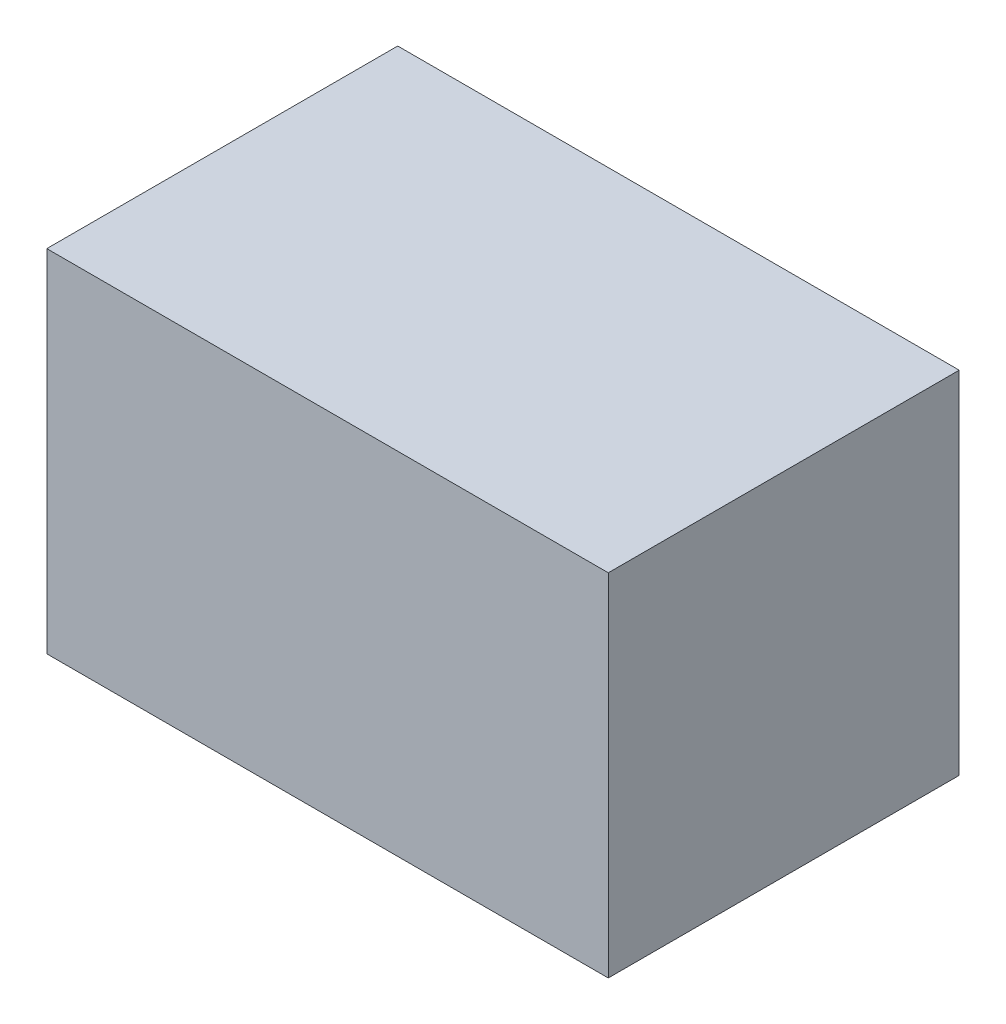
ISO-10303-21;
HEADER;
FILE_DESCRIPTION(('STEP AP214'),'2;1');
FILE_NAME('part.step','',(''),(''),'','','');
FILE_SCHEMA(('AUTOMOTIVE_DESIGN { 1 0 10303 214 1 1 1 1 }'));
ENDSEC;
DATA;
#1=APPLICATION_CONTEXT('core data for automotive mechanical design processes');
#2=APPLICATION_PROTOCOL_DEFINITION('international standard','automotive_design',2000,#1);
#3=PRODUCT_CONTEXT('',#1,'mechanical');
#4=PRODUCT('Part','Part','',(#3));
#5=PRODUCT_RELATED_PRODUCT_CATEGORY('part','',(#4));
#6=PRODUCT_DEFINITION_FORMATION('','',#4);
#7=PRODUCT_DEFINITION_CONTEXT('part definition',#1,'design');
#8=PRODUCT_DEFINITION('design','',#6,#7);
#9=PRODUCT_DEFINITION_SHAPE('','',#8);
#10=(LENGTH_UNIT() NAMED_UNIT(*) SI_UNIT(.MILLI.,.METRE.));
#11=(NAMED_UNIT(*) PLANE_ANGLE_UNIT() SI_UNIT($,.RADIAN.));
#12=(NAMED_UNIT(*) SI_UNIT($,.STERADIAN.) SOLID_ANGLE_UNIT());
#13=UNCERTAINTY_MEASURE_WITH_UNIT(LENGTH_MEASURE(1.E-05),#10,'distance_accuracy_value','');
#14=(GEOMETRIC_REPRESENTATION_CONTEXT(3) GLOBAL_UNCERTAINTY_ASSIGNED_CONTEXT((#13)) GLOBAL_UNIT_ASSIGNED_CONTEXT((#10,
#11,#12)) REPRESENTATION_CONTEXT('',''));
#15=CARTESIAN_POINT('',(0.,0.,0.));
#16=DIRECTION('',(0.,0.,1.));
#17=DIRECTION('',(1.,0.,0.));
#18=AXIS2_PLACEMENT_3D('',#15,#16,#17);
#19=CARTESIAN_POINT('',(0.4,-0.25,0.));
#20=DIRECTION('',(0.,-1.,0.));
#21=DIRECTION('',(0.,0.,-1.));
#22=AXIS2_PLACEMENT_3D('',#19,#20,#21);
#23=PLANE('',#22);
#24=DIRECTION('',(0.,0.,1.));
#25=VECTOR('',#24,1.);
#26=CARTESIAN_POINT('',(-0.4,-0.25,0.));
#27=LINE('',#26,#25);
#28=CARTESIAN_POINT('',(-0.4,-0.25,0.));
#29=VERTEX_POINT('',#28);
#30=CARTESIAN_POINT('',(-0.4,-0.25,0.5));
#31=VERTEX_POINT('',#30);
#32=EDGE_CURVE('E20',#29,#31,#27,.T.);
#33=ORIENTED_EDGE('',*,*,#32,.F.);
#34=DIRECTION('',(1.,0.,0.));
#35=VECTOR('',#34,1.);
#36=CARTESIAN_POINT('',(0.,-0.25,0.));
#37=LINE('',#36,#35);
#38=CARTESIAN_POINT('',(0.4,-0.25,0.));
#39=VERTEX_POINT('',#38);
#40=EDGE_CURVE('E80',#29,#39,#37,.T.);
#41=ORIENTED_EDGE('',*,*,#40,.T.);
#42=DIRECTION('',(0.,0.,-1.));
#43=VECTOR('',#42,1.);
#44=CARTESIAN_POINT('',(0.4,-0.25,0.));
#45=LINE('',#44,#43);
#46=CARTESIAN_POINT('',(0.4,-0.25,0.5));
#47=VERTEX_POINT('',#46);
#48=EDGE_CURVE('E68',#47,#39,#45,.T.);
#49=ORIENTED_EDGE('',*,*,#48,.F.);
#50=DIRECTION('',(1.,0.,0.));
#51=VECTOR('',#50,1.);
#52=CARTESIAN_POINT('',(0.,-0.25,0.5));
#53=LINE('',#52,#51);
#54=EDGE_CURVE('E56',#31,#47,#53,.T.);
#55=ORIENTED_EDGE('',*,*,#54,.F.);
#56=EDGE_LOOP('',(#33,#41,#49,#55));
#57=FACE_BOUND('',#56,.T.);
#58=ADVANCED_FACE('F17',(#57),#23,.T.);
#59=CARTESIAN_POINT('',(-0.4,-0.25,0.));
#60=DIRECTION('',(-1.,0.,0.));
#61=DIRECTION('',(0.,0.,1.));
#62=AXIS2_PLACEMENT_3D('',#59,#60,#61);
#63=PLANE('',#62);
#64=DIRECTION('',(0.,0.,1.));
#65=VECTOR('',#64,1.);
#66=CARTESIAN_POINT('',(-0.4,0.25,0.));
#67=LINE('',#66,#65);
#68=CARTESIAN_POINT('',(-0.4,0.25,0.));
#69=VERTEX_POINT('',#68);
#70=CARTESIAN_POINT('',(-0.4,0.25,0.5));
#71=VERTEX_POINT('',#70);
#72=EDGE_CURVE('E83',#69,#71,#67,.T.);
#73=ORIENTED_EDGE('',*,*,#72,.F.);
#74=DIRECTION('',(0.,1.,0.));
#75=VECTOR('',#74,1.);
#76=CARTESIAN_POINT('',(-0.4,0.,0.));
#77=LINE('',#76,#75);
#78=EDGE_CURVE('E65',#69,#29,#77,.F.);
#79=ORIENTED_EDGE('',*,*,#78,.T.);
#80=ORIENTED_EDGE('',*,*,#32,.T.);
#81=DIRECTION('',(0.,1.,0.));
#82=VECTOR('',#81,1.);
#83=CARTESIAN_POINT('',(-0.4,0.,0.5));
#84=LINE('',#83,#82);
#85=EDGE_CURVE('E62',#71,#31,#84,.F.);
#86=ORIENTED_EDGE('',*,*,#85,.F.);
#87=EDGE_LOOP('',(#73,#79,#80,#86));
#88=FACE_BOUND('',#87,.T.);
#89=ADVANCED_FACE('F61',(#88),#63,.T.);
#90=CARTESIAN_POINT('',(0.,0.,0.5));
#91=DIRECTION('',(0.,0.,1.));
#92=DIRECTION('',(1.,0.,0.));
#93=AXIS2_PLACEMENT_3D('',#90,#91,#92);
#94=PLANE('',#93);
#95=DIRECTION('',(0.,1.,0.));
#96=VECTOR('',#95,1.);
#97=CARTESIAN_POINT('',(0.4,0.25,0.5));
#98=LINE('',#97,#96);
#99=CARTESIAN_POINT('',(0.4,0.25,0.5));
#100=VERTEX_POINT('',#99);
#101=EDGE_CURVE('E70',#100,#47,#98,.F.);
#102=ORIENTED_EDGE('',*,*,#101,.F.);
#103=DIRECTION('',(1.,0.,0.));
#104=VECTOR('',#103,1.);
#105=CARTESIAN_POINT('',(-0.4,0.25,0.5));
#106=LINE('',#105,#104);
#107=EDGE_CURVE('E74',#71,#100,#106,.T.);
#108=ORIENTED_EDGE('',*,*,#107,.F.);
#109=ORIENTED_EDGE('',*,*,#85,.T.);
#110=ORIENTED_EDGE('',*,*,#54,.T.);
#111=EDGE_LOOP('',(#102,#108,#109,#110));
#112=FACE_BOUND('',#111,.T.);
#113=ADVANCED_FACE('F72',(#112),#94,.T.);
#114=CARTESIAN_POINT('',(0.4,0.25,0.));
#115=DIRECTION('',(1.,0.,0.));
#116=DIRECTION('',(0.,0.,-1.));
#117=AXIS2_PLACEMENT_3D('',#114,#115,#116);
#118=PLANE('',#117);
#119=ORIENTED_EDGE('',*,*,#48,.T.);
#120=DIRECTION('',(0.,1.,0.));
#121=VECTOR('',#120,1.);
#122=CARTESIAN_POINT('',(0.4,0.,0.));
#123=LINE('',#122,#121);
#124=CARTESIAN_POINT('',(0.4,0.25,0.));
#125=VERTEX_POINT('',#124);
#126=EDGE_CURVE('E35',#39,#125,#123,.T.);
#127=ORIENTED_EDGE('',*,*,#126,.T.);
#128=DIRECTION('',(0.,0.,1.));
#129=VECTOR('',#128,1.);
#130=CARTESIAN_POINT('',(0.4,0.25,0.));
#131=LINE('',#130,#129);
#132=EDGE_CURVE('E26',#100,#125,#131,.F.);
#133=ORIENTED_EDGE('',*,*,#132,.F.);
#134=ORIENTED_EDGE('',*,*,#101,.T.);
#135=EDGE_LOOP('',(#119,#127,#133,#134));
#136=FACE_BOUND('',#135,.T.);
#137=ADVANCED_FACE('F89',(#136),#118,.T.);
#138=CARTESIAN_POINT('',(0.,0.,0.));
#139=DIRECTION('',(0.,0.,1.));
#140=DIRECTION('',(1.,0.,0.));
#141=AXIS2_PLACEMENT_3D('',#138,#139,#140);
#142=PLANE('',#141);
#143=ORIENTED_EDGE('',*,*,#126,.F.);
#144=ORIENTED_EDGE('',*,*,#40,.F.);
#145=ORIENTED_EDGE('',*,*,#78,.F.);
#146=DIRECTION('',(1.,0.,0.));
#147=VECTOR('',#146,1.);
#148=CARTESIAN_POINT('',(-0.4,0.25,0.));
#149=LINE('',#148,#147);
#150=EDGE_CURVE('E11',#125,#69,#149,.F.);
#151=ORIENTED_EDGE('',*,*,#150,.F.);
#152=EDGE_LOOP('',(#143,#144,#145,#151));
#153=FACE_BOUND('',#152,.T.);
#154=ADVANCED_FACE('F91',(#153),#142,.F.);
#155=CARTESIAN_POINT('',(-0.4,0.25,0.));
#156=DIRECTION('',(0.,1.,0.));
#157=DIRECTION('',(0.,0.,1.));
#158=AXIS2_PLACEMENT_3D('',#155,#156,#157);
#159=PLANE('',#158);
#160=ORIENTED_EDGE('',*,*,#132,.T.);
#161=ORIENTED_EDGE('',*,*,#150,.T.);
#162=ORIENTED_EDGE('',*,*,#72,.T.);
#163=ORIENTED_EDGE('',*,*,#107,.T.);
#164=EDGE_LOOP('',(#160,#161,#162,#163));
#165=FACE_BOUND('',#164,.T.);
#166=ADVANCED_FACE('F88',(#165),#159,.T.);
#167=CLOSED_SHELL('',(#58,#89,#113,#137,#154,#166));
#168=MANIFOLD_SOLID_BREP('B1',#167);
#169=ADVANCED_BREP_SHAPE_REPRESENTATION('',(#18,#168),#14);
#170=SHAPE_DEFINITION_REPRESENTATION(#9,#169);
ENDSEC;
END-ISO-10303-21;
